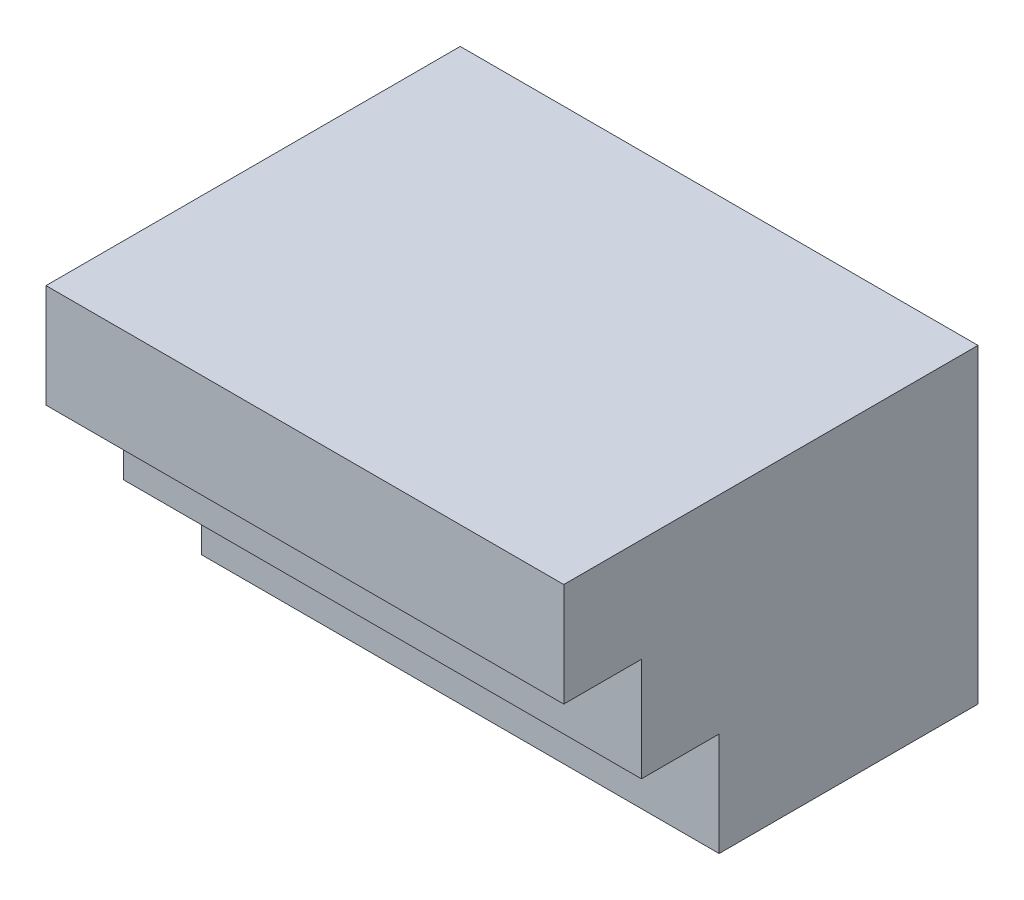
ISO-10303-21;
HEADER;
FILE_DESCRIPTION(('STEP AP214'),'2;1');
FILE_NAME('part.step','',(''),(''),'','','');
FILE_SCHEMA(('AUTOMOTIVE_DESIGN { 1 0 10303 214 1 1 1 1 }'));
ENDSEC;
DATA;
#1=APPLICATION_CONTEXT('core data for automotive mechanical design processes');
#2=APPLICATION_PROTOCOL_DEFINITION('international standard','automotive_design',2000,#1);
#3=PRODUCT_CONTEXT('',#1,'mechanical');
#4=PRODUCT('Part','Part','',(#3));
#5=PRODUCT_RELATED_PRODUCT_CATEGORY('part','',(#4));
#6=PRODUCT_DEFINITION_FORMATION('','',#4);
#7=PRODUCT_DEFINITION_CONTEXT('part definition',#1,'design');
#8=PRODUCT_DEFINITION('design','',#6,#7);
#9=PRODUCT_DEFINITION_SHAPE('','',#8);
#10=(LENGTH_UNIT() NAMED_UNIT(*) SI_UNIT(.MILLI.,.METRE.));
#11=(NAMED_UNIT(*) PLANE_ANGLE_UNIT() SI_UNIT($,.RADIAN.));
#12=(NAMED_UNIT(*) SI_UNIT($,.STERADIAN.) SOLID_ANGLE_UNIT());
#13=UNCERTAINTY_MEASURE_WITH_UNIT(LENGTH_MEASURE(1.E-05),#10,'distance_accuracy_value','');
#14=(GEOMETRIC_REPRESENTATION_CONTEXT(3) GLOBAL_UNCERTAINTY_ASSIGNED_CONTEXT((#13)) GLOBAL_UNIT_ASSIGNED_CONTEXT((#10,
#11,#12)) REPRESENTATION_CONTEXT('',''));
#15=CARTESIAN_POINT('',(0.,0.,0.));
#16=DIRECTION('',(0.,0.,1.));
#17=DIRECTION('',(1.,0.,0.));
#18=AXIS2_PLACEMENT_3D('',#15,#16,#17);
#19=CARTESIAN_POINT('',(0.,0.,100.));
#20=DIRECTION('',(0.,1.,0.));
#21=DIRECTION('',(0.,0.,1.));
#22=AXIS2_PLACEMENT_3D('',#19,#20,#21);
#23=PLANE('',#22);
#24=DIRECTION('',(1.,0.,0.));
#25=VECTOR('',#24,1.);
#26=CARTESIAN_POINT('',(0.,0.,0.));
#27=LINE('',#26,#25);
#28=CARTESIAN_POINT('',(0.,0.,0.));
#29=VERTEX_POINT('',#28);
#30=CARTESIAN_POINT('',(200.,0.,0.));
#31=VERTEX_POINT('',#30);
#32=EDGE_CURVE('E101',#29,#31,#27,.T.);
#33=ORIENTED_EDGE('',*,*,#32,.T.);
#34=DIRECTION('',(0.,0.,-1.));
#35=VECTOR('',#34,1.);
#36=CARTESIAN_POINT('',(200.,0.,100.));
#37=LINE('',#36,#35);
#38=CARTESIAN_POINT('',(200.,0.,100.));
#39=VERTEX_POINT('',#38);
#40=EDGE_CURVE('E11',#39,#31,#37,.T.);
#41=ORIENTED_EDGE('',*,*,#40,.F.);
#42=DIRECTION('',(1.,0.,0.));
#43=VECTOR('',#42,1.);
#44=CARTESIAN_POINT('',(0.,0.,100.));
#45=LINE('',#44,#43);
#46=CARTESIAN_POINT('',(0.,0.,100.));
#47=VERTEX_POINT('',#46);
#48=EDGE_CURVE('E93',#47,#39,#45,.T.);
#49=ORIENTED_EDGE('',*,*,#48,.F.);
#50=DIRECTION('',(0.,0.,-1.));
#51=VECTOR('',#50,1.);
#52=CARTESIAN_POINT('',(0.,0.,100.));
#53=LINE('',#52,#51);
#54=EDGE_CURVE('E51',#47,#29,#53,.T.);
#55=ORIENTED_EDGE('',*,*,#54,.T.);
#56=EDGE_LOOP('',(#33,#41,#49,#55));
#57=FACE_BOUND('',#56,.T.);
#58=ADVANCED_FACE('F43',(#57),#23,.F.);
#59=CARTESIAN_POINT('',(200.,0.,100.));
#60=DIRECTION('',(-1.,0.,0.));
#61=DIRECTION('',(0.,0.,1.));
#62=AXIS2_PLACEMENT_3D('',#59,#60,#61);
#63=PLANE('',#62);
#64=DIRECTION('',(0.,1.,0.));
#65=VECTOR('',#64,1.);
#66=CARTESIAN_POINT('',(200.,0.,0.));
#67=LINE('',#66,#65);
#68=CARTESIAN_POINT('',(200.,120.,0.));
#69=VERTEX_POINT('',#68);
#70=EDGE_CURVE('E71',#31,#69,#67,.T.);
#71=ORIENTED_EDGE('',*,*,#70,.T.);
#72=DIRECTION('',(0.,0.,-1.));
#73=VECTOR('',#72,1.);
#74=CARTESIAN_POINT('',(200.,120.,160.));
#75=LINE('',#74,#73);
#76=CARTESIAN_POINT('',(200.,120.,160.));
#77=VERTEX_POINT('',#76);
#78=EDGE_CURVE('E148',#77,#69,#75,.T.);
#79=ORIENTED_EDGE('',*,*,#78,.F.);
#80=DIRECTION('',(0.,-1.,0.));
#81=VECTOR('',#80,1.);
#82=CARTESIAN_POINT('',(200.,80.,160.));
#83=LINE('',#82,#81);
#84=CARTESIAN_POINT('',(200.,80.,160.));
#85=VERTEX_POINT('',#84);
#86=EDGE_CURVE('E162',#77,#85,#83,.T.);
#87=ORIENTED_EDGE('',*,*,#86,.T.);
#88=DIRECTION('',(0.,0.,-1.));
#89=VECTOR('',#88,1.);
#90=CARTESIAN_POINT('',(200.,80.,160.));
#91=LINE('',#90,#89);
#92=CARTESIAN_POINT('',(200.,80.,130.));
#93=VERTEX_POINT('',#92);
#94=EDGE_CURVE('E152',#85,#93,#91,.T.);
#95=ORIENTED_EDGE('',*,*,#94,.T.);
#96=DIRECTION('',(0.,1.,0.));
#97=VECTOR('',#96,1.);
#98=CARTESIAN_POINT('',(200.,0.,130.));
#99=LINE('',#98,#97);
#100=CARTESIAN_POINT('',(200.,40.,130.));
#101=VERTEX_POINT('',#100);
#102=EDGE_CURVE('E120',#101,#93,#99,.T.);
#103=ORIENTED_EDGE('',*,*,#102,.F.);
#104=DIRECTION('',(0.,0.,-1.));
#105=VECTOR('',#104,1.);
#106=CARTESIAN_POINT('',(200.,40.,130.));
#107=LINE('',#106,#105);
#108=CARTESIAN_POINT('',(200.,40.,100.));
#109=VERTEX_POINT('',#108);
#110=EDGE_CURVE('E91',#101,#109,#107,.T.);
#111=ORIENTED_EDGE('',*,*,#110,.T.);
#112=DIRECTION('',(0.,1.,0.));
#113=VECTOR('',#112,1.);
#114=CARTESIAN_POINT('',(200.,0.,100.));
#115=LINE('',#114,#113);
#116=EDGE_CURVE('E78',#39,#109,#115,.T.);
#117=ORIENTED_EDGE('',*,*,#116,.F.);
#118=ORIENTED_EDGE('',*,*,#40,.T.);
#119=EDGE_LOOP('',(#71,#79,#87,#95,#103,#111,#117,#118));
#120=FACE_BOUND('',#119,.T.);
#121=ADVANCED_FACE('F86',(#120),#63,.F.);
#122=CARTESIAN_POINT('',(0.,0.,100.));
#123=DIRECTION('',(-1.,0.,0.));
#124=DIRECTION('',(0.,0.,1.));
#125=AXIS2_PLACEMENT_3D('',#122,#123,#124);
#126=PLANE('',#125);
#127=DIRECTION('',(0.,1.,0.));
#128=VECTOR('',#127,1.);
#129=CARTESIAN_POINT('',(0.,0.,0.));
#130=LINE('',#129,#128);
#131=CARTESIAN_POINT('',(0.,120.,0.));
#132=VERTEX_POINT('',#131);
#133=EDGE_CURVE('E99',#29,#132,#130,.T.);
#134=ORIENTED_EDGE('',*,*,#133,.F.);
#135=ORIENTED_EDGE('',*,*,#54,.F.);
#136=DIRECTION('',(0.,1.,0.));
#137=VECTOR('',#136,1.);
#138=CARTESIAN_POINT('',(0.,0.,100.));
#139=LINE('',#138,#137);
#140=CARTESIAN_POINT('',(0.,40.,100.));
#141=VERTEX_POINT('',#140);
#142=EDGE_CURVE('E97',#47,#141,#139,.T.);
#143=ORIENTED_EDGE('',*,*,#142,.T.);
#144=DIRECTION('',(0.,0.,-1.));
#145=VECTOR('',#144,1.);
#146=CARTESIAN_POINT('',(0.,40.,130.));
#147=LINE('',#146,#145);
#148=CARTESIAN_POINT('',(0.,40.,130.));
#149=VERTEX_POINT('',#148);
#150=EDGE_CURVE('E105',#149,#141,#147,.T.);
#151=ORIENTED_EDGE('',*,*,#150,.F.);
#152=DIRECTION('',(0.,1.,0.));
#153=VECTOR('',#152,1.);
#154=CARTESIAN_POINT('',(0.,0.,130.));
#155=LINE('',#154,#153);
#156=CARTESIAN_POINT('',(0.,80.,130.));
#157=VERTEX_POINT('',#156);
#158=EDGE_CURVE('E114',#149,#157,#155,.T.);
#159=ORIENTED_EDGE('',*,*,#158,.T.);
#160=DIRECTION('',(0.,0.,-1.));
#161=VECTOR('',#160,1.);
#162=CARTESIAN_POINT('',(0.,80.,160.));
#163=LINE('',#162,#161);
#164=CARTESIAN_POINT('',(0.,80.,160.));
#165=VERTEX_POINT('',#164);
#166=EDGE_CURVE('E144',#165,#157,#163,.T.);
#167=ORIENTED_EDGE('',*,*,#166,.F.);
#168=DIRECTION('',(0.,1.,0.));
#169=VECTOR('',#168,1.);
#170=CARTESIAN_POINT('',(0.,80.,160.));
#171=LINE('',#170,#169);
#172=CARTESIAN_POINT('',(0.,120.,160.));
#173=VERTEX_POINT('',#172);
#174=EDGE_CURVE('E159',#165,#173,#171,.T.);
#175=ORIENTED_EDGE('',*,*,#174,.T.);
#176=DIRECTION('',(0.,0.,-1.));
#177=VECTOR('',#176,1.);
#178=CARTESIAN_POINT('',(0.,120.,160.));
#179=LINE('',#178,#177);
#180=EDGE_CURVE('E145',#173,#132,#179,.T.);
#181=ORIENTED_EDGE('',*,*,#180,.T.);
#182=EDGE_LOOP('',(#134,#135,#143,#151,#159,#167,#175,#181));
#183=FACE_BOUND('',#182,.T.);
#184=ADVANCED_FACE('F172',(#183),#126,.T.);
#185=CARTESIAN_POINT('',(0.,0.,100.));
#186=DIRECTION('',(0.,0.,1.));
#187=DIRECTION('',(1.,0.,0.));
#188=AXIS2_PLACEMENT_3D('',#185,#186,#187);
#189=PLANE('',#188);
#190=ORIENTED_EDGE('',*,*,#48,.T.);
#191=ORIENTED_EDGE('',*,*,#116,.T.);
#192=DIRECTION('',(1.,0.,0.));
#193=VECTOR('',#192,1.);
#194=CARTESIAN_POINT('',(0.,40.,100.));
#195=LINE('',#194,#193);
#196=EDGE_CURVE('E92',#141,#109,#195,.T.);
#197=ORIENTED_EDGE('',*,*,#196,.F.);
#198=ORIENTED_EDGE('',*,*,#142,.F.);
#199=EDGE_LOOP('',(#190,#191,#197,#198));
#200=FACE_BOUND('',#199,.T.);
#201=ADVANCED_FACE('F96',(#200),#189,.T.);
#202=CARTESIAN_POINT('',(0.,0.,0.));
#203=DIRECTION('',(0.,0.,1.));
#204=DIRECTION('',(1.,0.,0.));
#205=AXIS2_PLACEMENT_3D('',#202,#203,#204);
#206=PLANE('',#205);
#207=ORIENTED_EDGE('',*,*,#32,.F.);
#208=ORIENTED_EDGE('',*,*,#133,.T.);
#209=DIRECTION('',(1.,0.,0.));
#210=VECTOR('',#209,1.);
#211=CARTESIAN_POINT('',(0.,120.,0.));
#212=LINE('',#211,#210);
#213=EDGE_CURVE('E157',#132,#69,#212,.T.);
#214=ORIENTED_EDGE('',*,*,#213,.T.);
#215=ORIENTED_EDGE('',*,*,#70,.F.);
#216=EDGE_LOOP('',(#207,#208,#214,#215));
#217=FACE_BOUND('',#216,.T.);
#218=ADVANCED_FACE('F198',(#217),#206,.F.);
#219=CARTESIAN_POINT('',(0.,40.,130.));
#220=DIRECTION('',(0.,1.,0.));
#221=DIRECTION('',(0.,0.,1.));
#222=AXIS2_PLACEMENT_3D('',#219,#220,#221);
#223=PLANE('',#222);
#224=ORIENTED_EDGE('',*,*,#150,.T.);
#225=ORIENTED_EDGE('',*,*,#196,.T.);
#226=ORIENTED_EDGE('',*,*,#110,.F.);
#227=DIRECTION('',(1.,0.,0.));
#228=VECTOR('',#227,1.);
#229=CARTESIAN_POINT('',(0.,40.,130.));
#230=LINE('',#229,#228);
#231=EDGE_CURVE('E123',#149,#101,#230,.T.);
#232=ORIENTED_EDGE('',*,*,#231,.F.);
#233=EDGE_LOOP('',(#224,#225,#226,#232));
#234=FACE_BOUND('',#233,.T.);
#235=ADVANCED_FACE('F207',(#234),#223,.F.);
#236=CARTESIAN_POINT('',(0.,0.,130.));
#237=DIRECTION('',(0.,0.,1.));
#238=DIRECTION('',(1.,0.,0.));
#239=AXIS2_PLACEMENT_3D('',#236,#237,#238);
#240=PLANE('',#239);
#241=CARTESIAN_POINT('',(96.8517181487982,58.9701328617309,130.));
#242=DIRECTION('',(0.,0.,1.));
#243=DIRECTION('',(1.,0.,0.));
#244=AXIS2_PLACEMENT_3D('',#241,#242,#243);
#245=CIRCLE('',#244,5.);
#246=CARTESIAN_POINT('',(101.851718148798,58.9701328617309,130.));
#247=VERTEX_POINT('',#246);
#248=EDGE_CURVE('E141',#247,#247,#245,.T.);
#249=ORIENTED_EDGE('',*,*,#248,.F.);
#250=EDGE_LOOP('',(#249));
#251=FACE_BOUND('',#250,.T.);
#252=CARTESIAN_POINT('',(154.363330884473,58.9701328617309,130.));
#253=DIRECTION('',(0.,0.,1.));
#254=DIRECTION('',(1.,0.,0.));
#255=AXIS2_PLACEMENT_3D('',#252,#253,#254);
#256=CIRCLE('',#255,4.99999999999999);
#257=CARTESIAN_POINT('',(159.363330884473,58.9701328617309,130.));
#258=VERTEX_POINT('',#257);
#259=EDGE_CURVE('E135',#258,#258,#256,.T.);
#260=ORIENTED_EDGE('',*,*,#259,.F.);
#261=EDGE_LOOP('',(#260));
#262=FACE_BOUND('',#261,.T.);
#263=CARTESIAN_POINT('',(39.3229583620865,58.9701328617309,130.));
#264=DIRECTION('',(0.,0.,1.));
#265=DIRECTION('',(1.,0.,0.));
#266=AXIS2_PLACEMENT_3D('',#263,#264,#265);
#267=CIRCLE('',#266,5.);
#268=CARTESIAN_POINT('',(44.3229583620865,58.9701328617309,130.));
#269=VERTEX_POINT('',#268);
#270=EDGE_CURVE('E129',#269,#269,#267,.T.);
#271=ORIENTED_EDGE('',*,*,#270,.F.);
#272=EDGE_LOOP('',(#271));
#273=FACE_BOUND('',#272,.T.);
#274=ORIENTED_EDGE('',*,*,#231,.T.);
#275=ORIENTED_EDGE('',*,*,#102,.T.);
#276=DIRECTION('',(1.,0.,0.));
#277=VECTOR('',#276,1.);
#278=CARTESIAN_POINT('',(0.,80.,130.));
#279=LINE('',#278,#277);
#280=EDGE_CURVE('E117',#157,#93,#279,.T.);
#281=ORIENTED_EDGE('',*,*,#280,.F.);
#282=ORIENTED_EDGE('',*,*,#158,.F.);
#283=EDGE_LOOP('',(#274,#275,#281,#282));
#284=FACE_BOUND('',#283,.T.);
#285=ADVANCED_FACE('F205',(#251,#262,#273,#284),#240,.T.);
#286=CARTESIAN_POINT('',(39.3229583620865,58.9701328617309,130.));
#287=DIRECTION('',(0.,0.,1.));
#288=DIRECTION('',(1.,0.,0.));
#289=AXIS2_PLACEMENT_3D('',#286,#287,#288);
#290=CONICAL_SURFACE('',#289,5.,0.0174532925199433);
#291=CARTESIAN_POINT('',(39.3229583620865,58.9701328617309,95.));
#292=DIRECTION('',(0.,0.,1.));
#293=DIRECTION('',(1.,0.,0.));
#294=AXIS2_PLACEMENT_3D('',#291,#292,#293);
#295=CIRCLE('',#294,4.38907272751238);
#296=CARTESIAN_POINT('',(43.7120310895989,58.9701328617309,95.));
#297=VERTEX_POINT('',#296);
#298=EDGE_CURVE('E126',#297,#297,#295,.T.);
#299=ORIENTED_EDGE('',*,*,#298,.F.);
#300=EDGE_LOOP('',(#299));
#301=FACE_BOUND('',#300,.T.);
#302=ORIENTED_EDGE('',*,*,#270,.T.);
#303=EDGE_LOOP('',(#302));
#304=FACE_BOUND('',#303,.T.);
#305=ADVANCED_FACE('F213',(#301,#304),#290,.F.);
#306=CARTESIAN_POINT('',(39.3229583620865,58.9701328617309,95.));
#307=DIRECTION('',(0.,0.,1.));
#308=DIRECTION('',(1.,0.,0.));
#309=AXIS2_PLACEMENT_3D('',#306,#307,#308);
#310=PLANE('',#309);
#311=ORIENTED_EDGE('',*,*,#298,.T.);
#312=EDGE_LOOP('',(#311));
#313=FACE_BOUND('',#312,.T.);
#314=ADVANCED_FACE('F278',(#313),#310,.T.);
#315=CARTESIAN_POINT('',(154.363330884473,58.9701328617309,130.));
#316=DIRECTION('',(0.,0.,1.));
#317=DIRECTION('',(1.,0.,0.));
#318=AXIS2_PLACEMENT_3D('',#315,#316,#317);
#319=CONICAL_SURFACE('',#318,4.99999999999999,0.0174532925199433);
#320=CARTESIAN_POINT('',(154.363330884473,58.9701328617309,105.));
#321=DIRECTION('',(0.,0.,1.));
#322=DIRECTION('',(1.,0.,0.));
#323=AXIS2_PLACEMENT_3D('',#320,#321,#322);
#324=CIRCLE('',#323,4.56362337679455);
#325=CARTESIAN_POINT('',(158.926954261268,58.9701328617309,105.));
#326=VERTEX_POINT('',#325);
#327=EDGE_CURVE('E132',#326,#326,#324,.T.);
#328=ORIENTED_EDGE('',*,*,#327,.F.);
#329=EDGE_LOOP('',(#328));
#330=FACE_BOUND('',#329,.T.);
#331=ORIENTED_EDGE('',*,*,#259,.T.);
#332=EDGE_LOOP('',(#331));
#333=FACE_BOUND('',#332,.T.);
#334=ADVANCED_FACE('F286',(#330,#333),#319,.F.);
#335=CARTESIAN_POINT('',(0.,0.,105.));
#336=DIRECTION('',(0.,0.,1.));
#337=DIRECTION('',(1.,0.,0.));
#338=AXIS2_PLACEMENT_3D('',#335,#336,#337);
#339=PLANE('',#338);
#340=ORIENTED_EDGE('',*,*,#327,.T.);
#341=EDGE_LOOP('',(#340));
#342=FACE_BOUND('',#341,.T.);
#343=ADVANCED_FACE('F294',(#342),#339,.T.);
#344=CARTESIAN_POINT('',(96.8517181487982,58.9701328617309,130.));
#345=DIRECTION('',(0.,0.,1.));
#346=DIRECTION('',(1.,0.,0.));
#347=AXIS2_PLACEMENT_3D('',#344,#345,#346);
#348=CONICAL_SURFACE('',#347,5.,0.0174532925199433);
#349=CARTESIAN_POINT('',(96.8517181487982,58.9701328617309,100.));
#350=DIRECTION('',(0.,0.,1.));
#351=DIRECTION('',(1.,0.,0.));
#352=AXIS2_PLACEMENT_3D('',#349,#350,#351);
#353=CIRCLE('',#352,4.47634805215348);
#354=CARTESIAN_POINT('',(101.328066200952,58.9701328617309,100.));
#355=VERTEX_POINT('',#354);
#356=EDGE_CURVE('E138',#355,#355,#353,.T.);
#357=ORIENTED_EDGE('',*,*,#356,.F.);
#358=EDGE_LOOP('',(#357));
#359=FACE_BOUND('',#358,.T.);
#360=ORIENTED_EDGE('',*,*,#248,.T.);
#361=EDGE_LOOP('',(#360));
#362=FACE_BOUND('',#361,.T.);
#363=ADVANCED_FACE('F302',(#359,#362),#348,.F.);
#364=CARTESIAN_POINT('',(0.,0.,100.));
#365=DIRECTION('',(0.,0.,1.));
#366=DIRECTION('',(1.,0.,0.));
#367=AXIS2_PLACEMENT_3D('',#364,#365,#366);
#368=PLANE('',#367);
#369=ORIENTED_EDGE('',*,*,#356,.T.);
#370=EDGE_LOOP('',(#369));
#371=FACE_BOUND('',#370,.T.);
#372=ADVANCED_FACE('F258',(#371),#368,.T.);
#373=CARTESIAN_POINT('',(0.,80.,160.));
#374=DIRECTION('',(0.,-1.,0.));
#375=DIRECTION('',(0.,0.,-1.));
#376=AXIS2_PLACEMENT_3D('',#373,#374,#375);
#377=PLANE('',#376);
#378=ORIENTED_EDGE('',*,*,#166,.T.);
#379=ORIENTED_EDGE('',*,*,#280,.T.);
#380=ORIENTED_EDGE('',*,*,#94,.F.);
#381=DIRECTION('',(-1.,0.,0.));
#382=VECTOR('',#381,1.);
#383=CARTESIAN_POINT('',(0.,80.,160.));
#384=LINE('',#383,#382);
#385=EDGE_CURVE('E149',#85,#165,#384,.T.);
#386=ORIENTED_EDGE('',*,*,#385,.T.);
#387=EDGE_LOOP('',(#378,#379,#380,#386));
#388=FACE_BOUND('',#387,.T.);
#389=ADVANCED_FACE('F190',(#388),#377,.T.);
#390=CARTESIAN_POINT('',(0.,120.,160.));
#391=DIRECTION('',(0.,1.,0.));
#392=DIRECTION('',(-1.,0.,0.));
#393=AXIS2_PLACEMENT_3D('',#390,#391,#392);
#394=PLANE('',#393);
#395=ORIENTED_EDGE('',*,*,#213,.F.);
#396=ORIENTED_EDGE('',*,*,#180,.F.);
#397=DIRECTION('',(1.,0.,0.));
#398=VECTOR('',#397,1.);
#399=CARTESIAN_POINT('',(0.,120.,160.));
#400=LINE('',#399,#398);
#401=EDGE_CURVE('E165',#173,#77,#400,.T.);
#402=ORIENTED_EDGE('',*,*,#401,.T.);
#403=ORIENTED_EDGE('',*,*,#78,.T.);
#404=EDGE_LOOP('',(#395,#396,#402,#403));
#405=FACE_BOUND('',#404,.T.);
#406=ADVANCED_FACE('F196',(#405),#394,.T.);
#407=CARTESIAN_POINT('',(0.,0.,160.));
#408=DIRECTION('',(0.,0.,-1.));
#409=DIRECTION('',(-1.,0.,0.));
#410=AXIS2_PLACEMENT_3D('',#407,#408,#409);
#411=PLANE('',#410);
#412=ORIENTED_EDGE('',*,*,#174,.F.);
#413=ORIENTED_EDGE('',*,*,#385,.F.);
#414=ORIENTED_EDGE('',*,*,#86,.F.);
#415=ORIENTED_EDGE('',*,*,#401,.F.);
#416=EDGE_LOOP('',(#412,#413,#414,#415));
#417=FACE_BOUND('',#416,.T.);
#418=ADVANCED_FACE('F183',(#417),#411,.F.);
#419=CLOSED_SHELL('',(#58,#121,#184,#201,#218,#235,#285,#305,#314,#334,#343,#363,#372,#389,#406,#418));
#420=MANIFOLD_SOLID_BREP('B2',#419);
#421=ADVANCED_BREP_SHAPE_REPRESENTATION('',(#18,#420),#14);
#422=SHAPE_DEFINITION_REPRESENTATION(#9,#421);
ENDSEC;
END-ISO-10303-21;
